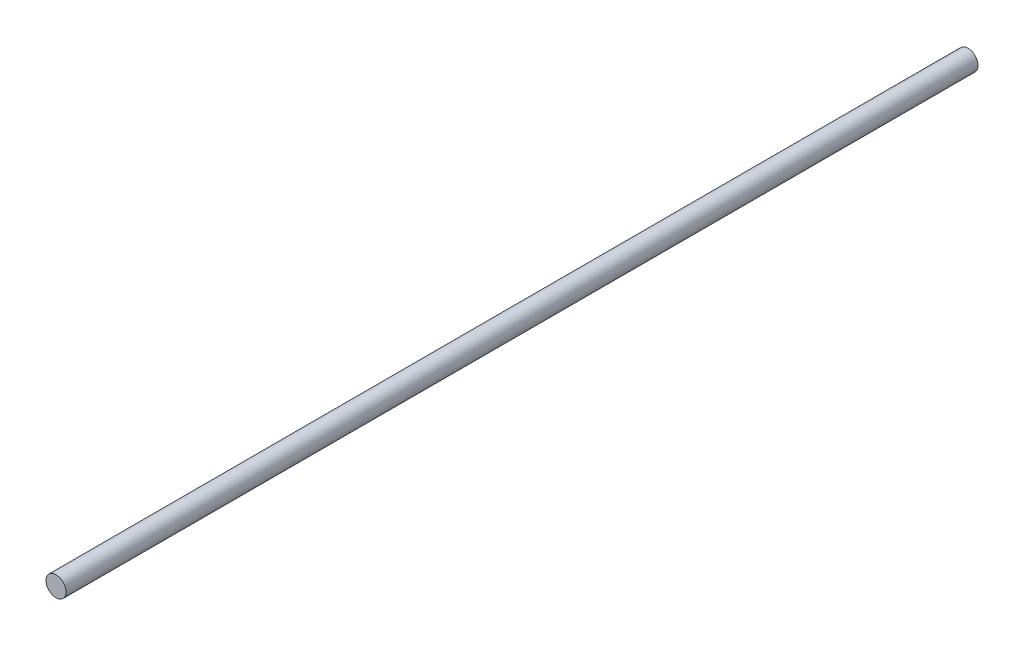
ISO-10303-21;
HEADER;
FILE_DESCRIPTION(('STEP AP214'),'2;1');
FILE_NAME('part.step','',(''),(''),'','','');
FILE_SCHEMA(('AUTOMOTIVE_DESIGN { 1 0 10303 214 1 1 1 1 }'));
ENDSEC;
DATA;
#1=APPLICATION_CONTEXT('core data for automotive mechanical design processes');
#2=APPLICATION_PROTOCOL_DEFINITION('international standard','automotive_design',2000,#1);
#3=PRODUCT_CONTEXT('',#1,'mechanical');
#4=PRODUCT('Part','Part','',(#3));
#5=PRODUCT_RELATED_PRODUCT_CATEGORY('part','',(#4));
#6=PRODUCT_DEFINITION_FORMATION('','',#4);
#7=PRODUCT_DEFINITION_CONTEXT('part definition',#1,'design');
#8=PRODUCT_DEFINITION('design','',#6,#7);
#9=PRODUCT_DEFINITION_SHAPE('','',#8);
#10=(LENGTH_UNIT() NAMED_UNIT(*) SI_UNIT(.MILLI.,.METRE.));
#11=(NAMED_UNIT(*) PLANE_ANGLE_UNIT() SI_UNIT($,.RADIAN.));
#12=(NAMED_UNIT(*) SI_UNIT($,.STERADIAN.) SOLID_ANGLE_UNIT());
#13=UNCERTAINTY_MEASURE_WITH_UNIT(LENGTH_MEASURE(1.E-05),#10,'distance_accuracy_value','');
#14=(GEOMETRIC_REPRESENTATION_CONTEXT(3) GLOBAL_UNCERTAINTY_ASSIGNED_CONTEXT((#13)) GLOBAL_UNIT_ASSIGNED_CONTEXT((#10,
#11,#12)) REPRESENTATION_CONTEXT('',''));
#15=CARTESIAN_POINT('',(0.,0.,0.));
#16=DIRECTION('',(0.,0.,1.));
#17=DIRECTION('',(1.,0.,0.));
#18=AXIS2_PLACEMENT_3D('',#15,#16,#17);
#19=CARTESIAN_POINT('',(0.,0.,125.));
#20=DIRECTION('',(0.,0.,-1.));
#21=DIRECTION('',(-1.,0.,0.));
#22=AXIS2_PLACEMENT_3D('',#19,#20,#21);
#23=CYLINDRICAL_SURFACE('',#22,2.75);
#24=CARTESIAN_POINT('',(0.,0.,125.));
#25=DIRECTION('',(0.,0.,1.));
#26=DIRECTION('',(1.,0.,0.));
#27=AXIS2_PLACEMENT_3D('',#24,#25,#26);
#28=CIRCLE('',#27,2.75);
#29=CARTESIAN_POINT('',(2.75,0.,125.));
#30=VERTEX_POINT('',#29);
#31=EDGE_CURVE('E10',#30,#30,#28,.T.);
#32=ORIENTED_EDGE('',*,*,#31,.F.);
#33=EDGE_LOOP('',(#32));
#34=FACE_BOUND('',#33,.T.);
#35=CARTESIAN_POINT('',(0.,0.,-125.));
#36=DIRECTION('',(0.,0.,1.));
#37=DIRECTION('',(1.,0.,0.));
#38=AXIS2_PLACEMENT_3D('',#35,#36,#37);
#39=CIRCLE('',#38,2.75);
#40=CARTESIAN_POINT('',(2.75,0.,-125.));
#41=VERTEX_POINT('',#40);
#42=EDGE_CURVE('E46',#41,#41,#39,.T.);
#43=ORIENTED_EDGE('',*,*,#42,.T.);
#44=EDGE_LOOP('',(#43));
#45=FACE_BOUND('',#44,.T.);
#46=ADVANCED_FACE('F43',(#34,#45),#23,.T.);
#47=CARTESIAN_POINT('',(0.,0.,125.));
#48=DIRECTION('',(0.,0.,1.));
#49=DIRECTION('',(1.,0.,0.));
#50=AXIS2_PLACEMENT_3D('',#47,#48,#49);
#51=PLANE('',#50);
#52=ORIENTED_EDGE('',*,*,#31,.T.);
#53=EDGE_LOOP('',(#52));
#54=FACE_BOUND('',#53,.T.);
#55=ADVANCED_FACE('F60',(#54),#51,.T.);
#56=CARTESIAN_POINT('',(0.,0.,-125.));
#57=DIRECTION('',(0.,0.,1.));
#58=DIRECTION('',(1.,0.,0.));
#59=AXIS2_PLACEMENT_3D('',#56,#57,#58);
#60=PLANE('',#59);
#61=ORIENTED_EDGE('',*,*,#42,.F.);
#62=EDGE_LOOP('',(#61));
#63=FACE_BOUND('',#62,.T.);
#64=ADVANCED_FACE('F58',(#63),#60,.F.);
#65=CLOSED_SHELL('',(#46,#55,#64));
#66=MANIFOLD_SOLID_BREP('B2',#65);
#67=ADVANCED_BREP_SHAPE_REPRESENTATION('',(#18,#66),#14);
#68=SHAPE_DEFINITION_REPRESENTATION(#9,#67);
ENDSEC;
END-ISO-10303-21;
